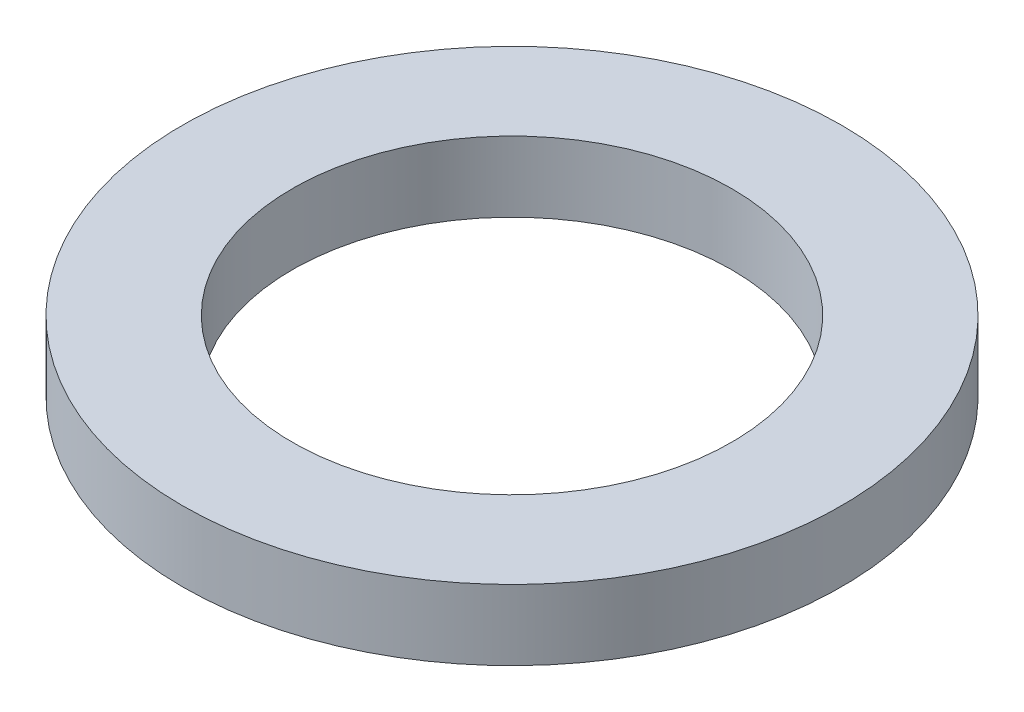
ISO-10303-21;
HEADER;
FILE_DESCRIPTION(('STEP AP214'),'2;1');
FILE_NAME('part.step','',(''),(''),'','','');
FILE_SCHEMA(('AUTOMOTIVE_DESIGN { 1 0 10303 214 1 1 1 1 }'));
ENDSEC;
DATA;
#1=APPLICATION_CONTEXT('core data for automotive mechanical design processes');
#2=APPLICATION_PROTOCOL_DEFINITION('international standard','automotive_design',2000,#1);
#3=PRODUCT_CONTEXT('',#1,'mechanical');
#4=PRODUCT('Part','Part','',(#3));
#5=PRODUCT_RELATED_PRODUCT_CATEGORY('part','',(#4));
#6=PRODUCT_DEFINITION_FORMATION('','',#4);
#7=PRODUCT_DEFINITION_CONTEXT('part definition',#1,'design');
#8=PRODUCT_DEFINITION('design','',#6,#7);
#9=PRODUCT_DEFINITION_SHAPE('','',#8);
#10=(LENGTH_UNIT() NAMED_UNIT(*) SI_UNIT(.MILLI.,.METRE.));
#11=(NAMED_UNIT(*) PLANE_ANGLE_UNIT() SI_UNIT($,.RADIAN.));
#12=(NAMED_UNIT(*) SI_UNIT($,.STERADIAN.) SOLID_ANGLE_UNIT());
#13=UNCERTAINTY_MEASURE_WITH_UNIT(LENGTH_MEASURE(1.E-05),#10,'distance_accuracy_value','');
#14=(GEOMETRIC_REPRESENTATION_CONTEXT(3) GLOBAL_UNCERTAINTY_ASSIGNED_CONTEXT((#13)) GLOBAL_UNIT_ASSIGNED_CONTEXT((#10,
#11,#12)) REPRESENTATION_CONTEXT('',''));
#15=CARTESIAN_POINT('',(0.,0.,0.));
#16=DIRECTION('',(0.,0.,1.));
#17=DIRECTION('',(1.,0.,0.));
#18=AXIS2_PLACEMENT_3D('',#15,#16,#17);
#19=CARTESIAN_POINT('',(0.,0.32,0.));
#20=DIRECTION('',(0.,1.,0.));
#21=DIRECTION('',(0.,0.,1.));
#22=AXIS2_PLACEMENT_3D('',#19,#20,#21);
#23=PLANE('',#22);
#24=CARTESIAN_POINT('',(0.,0.32,0.));
#25=DIRECTION('',(0.,1.,0.));
#26=DIRECTION('',(0.,0.,1.));
#27=AXIS2_PLACEMENT_3D('',#24,#25,#26);
#28=CIRCLE('',#27,1.5);
#29=CARTESIAN_POINT('',(0.,0.32,-1.5));
#30=VERTEX_POINT('',#29);
#31=EDGE_CURVE('E10',#30,#30,#28,.T.);
#32=ORIENTED_EDGE('',*,*,#31,.T.);
#33=EDGE_LOOP('',(#32));
#34=FACE_BOUND('',#33,.T.);
#35=CARTESIAN_POINT('',(0.,0.32,0.));
#36=DIRECTION('',(0.,1.,0.));
#37=DIRECTION('',(0.,0.,1.));
#38=AXIS2_PLACEMENT_3D('',#35,#36,#37);
#39=CIRCLE('',#38,1.);
#40=CARTESIAN_POINT('',(0.,0.32,-1.));
#41=VERTEX_POINT('',#40);
#42=EDGE_CURVE('E41',#41,#41,#39,.T.);
#43=ORIENTED_EDGE('',*,*,#42,.F.);
#44=EDGE_LOOP('',(#43));
#45=FACE_BOUND('',#44,.T.);
#46=ADVANCED_FACE('F30',(#34,#45),#23,.T.);
#47=CARTESIAN_POINT('',(0.,0.,0.));
#48=DIRECTION('',(0.,1.,0.));
#49=DIRECTION('',(0.,0.,1.));
#50=AXIS2_PLACEMENT_3D('',#47,#48,#49);
#51=PLANE('',#50);
#52=CARTESIAN_POINT('',(0.,0.,0.));
#53=DIRECTION('',(0.,1.,0.));
#54=DIRECTION('',(0.,0.,1.));
#55=AXIS2_PLACEMENT_3D('',#52,#53,#54);
#56=CIRCLE('',#55,1.5);
#57=CARTESIAN_POINT('',(0.,0.,-1.5));
#58=VERTEX_POINT('',#57);
#59=EDGE_CURVE('E34',#58,#58,#56,.T.);
#60=ORIENTED_EDGE('',*,*,#59,.F.);
#61=EDGE_LOOP('',(#60));
#62=FACE_BOUND('',#61,.T.);
#63=CARTESIAN_POINT('',(0.,0.,0.));
#64=DIRECTION('',(0.,1.,0.));
#65=DIRECTION('',(0.,0.,1.));
#66=AXIS2_PLACEMENT_3D('',#63,#64,#65);
#67=CIRCLE('',#66,1.);
#68=CARTESIAN_POINT('',(0.,0.,-1.));
#69=VERTEX_POINT('',#68);
#70=EDGE_CURVE('E43',#69,#69,#67,.T.);
#71=ORIENTED_EDGE('',*,*,#70,.T.);
#72=EDGE_LOOP('',(#71));
#73=FACE_BOUND('',#72,.T.);
#74=ADVANCED_FACE('F53',(#62,#73),#51,.F.);
#75=CARTESIAN_POINT('',(0.,0.32,0.));
#76=DIRECTION('',(0.,-1.,0.));
#77=DIRECTION('',(0.,0.,-1.));
#78=AXIS2_PLACEMENT_3D('',#75,#76,#77);
#79=CYLINDRICAL_SURFACE('',#78,1.5);
#80=CARTESIAN_POINT('',(0.,0.32,-1.5));
#81=CARTESIAN_POINT('',(0.,0.316666666666667,-1.5));
#82=CARTESIAN_POINT('',(0.,0.313333333333333,-1.5));
#83=CARTESIAN_POINT('',(0.,0.306666666666667,-1.5));
#84=CARTESIAN_POINT('',(0.,0.303333333333333,-1.5));
#85=CARTESIAN_POINT('',(0.,0.296666666666667,-1.5));
#86=CARTESIAN_POINT('',(0.,0.293333333333333,-1.5));
#87=CARTESIAN_POINT('',(0.,0.286666666666667,-1.5));
#88=CARTESIAN_POINT('',(0.,0.283333333333333,-1.5));
#89=CARTESIAN_POINT('',(0.,0.276666666666667,-1.5));
#90=CARTESIAN_POINT('',(0.,0.273333333333333,-1.5));
#91=CARTESIAN_POINT('',(0.,0.266666666666667,-1.5));
#92=CARTESIAN_POINT('',(0.,0.263333333333333,-1.5));
#93=CARTESIAN_POINT('',(0.,0.256666666666667,-1.5));
#94=CARTESIAN_POINT('',(0.,0.253333333333333,-1.5));
#95=CARTESIAN_POINT('',(0.,0.246666666666667,-1.5));
#96=CARTESIAN_POINT('',(0.,0.243333333333333,-1.5));
#97=CARTESIAN_POINT('',(0.,0.236666666666667,-1.5));
#98=CARTESIAN_POINT('',(0.,0.233333333333333,-1.5));
#99=CARTESIAN_POINT('',(0.,0.226666666666667,-1.5));
#100=CARTESIAN_POINT('',(0.,0.223333333333333,-1.5));
#101=CARTESIAN_POINT('',(0.,0.216666666666667,-1.5));
#102=CARTESIAN_POINT('',(0.,0.213333333333333,-1.5));
#103=CARTESIAN_POINT('',(0.,0.206666666666667,-1.5));
#104=CARTESIAN_POINT('',(0.,0.203333333333333,-1.5));
#105=CARTESIAN_POINT('',(0.,0.196666666666667,-1.5));
#106=CARTESIAN_POINT('',(0.,0.193333333333333,-1.5));
#107=CARTESIAN_POINT('',(0.,0.186666666666667,-1.5));
#108=CARTESIAN_POINT('',(0.,0.183333333333333,-1.5));
#109=CARTESIAN_POINT('',(0.,0.176666666666667,-1.5));
#110=CARTESIAN_POINT('',(0.,0.173333333333333,-1.5));
#111=CARTESIAN_POINT('',(0.,0.166666666666667,-1.5));
#112=CARTESIAN_POINT('',(0.,0.163333333333333,-1.5));
#113=CARTESIAN_POINT('',(0.,0.156666666666667,-1.5));
#114=CARTESIAN_POINT('',(0.,0.153333333333333,-1.5));
#115=CARTESIAN_POINT('',(0.,0.146666666666667,-1.5));
#116=CARTESIAN_POINT('',(0.,0.143333333333333,-1.5));
#117=CARTESIAN_POINT('',(0.,0.136666666666667,-1.5));
#118=CARTESIAN_POINT('',(0.,0.133333333333333,-1.5));
#119=CARTESIAN_POINT('',(0.,0.126666666666667,-1.5));
#120=CARTESIAN_POINT('',(0.,0.123333333333333,-1.5));
#121=CARTESIAN_POINT('',(0.,0.116666666666667,-1.5));
#122=CARTESIAN_POINT('',(0.,0.113333333333333,-1.5));
#123=CARTESIAN_POINT('',(0.,0.106666666666667,-1.5));
#124=CARTESIAN_POINT('',(0.,0.103333333333333,-1.5));
#125=CARTESIAN_POINT('',(0.,0.0966666666666667,-1.5));
#126=CARTESIAN_POINT('',(0.,0.0933333333333334,-1.5));
#127=CARTESIAN_POINT('',(0.,0.0866666666666667,-1.5));
#128=CARTESIAN_POINT('',(0.,0.0833333333333333,-1.5));
#129=CARTESIAN_POINT('',(0.,0.0766666666666667,-1.5));
#130=CARTESIAN_POINT('',(0.,0.0733333333333333,-1.5));
#131=CARTESIAN_POINT('',(0.,0.0666666666666667,-1.5));
#132=CARTESIAN_POINT('',(0.,0.0633333333333333,-1.5));
#133=CARTESIAN_POINT('',(0.,0.0566666666666667,-1.5));
#134=CARTESIAN_POINT('',(0.,0.0533333333333333,-1.5));
#135=CARTESIAN_POINT('',(0.,0.0466666666666667,-1.5));
#136=CARTESIAN_POINT('',(0.,0.0433333333333333,-1.5));
#137=CARTESIAN_POINT('',(0.,0.0366666666666667,-1.5));
#138=CARTESIAN_POINT('',(0.,0.0333333333333333,-1.5));
#139=CARTESIAN_POINT('',(0.,0.0266666666666667,-1.5));
#140=CARTESIAN_POINT('',(0.,0.0233333333333333,-1.5));
#141=CARTESIAN_POINT('',(0.,0.0166666666666667,-1.5));
#142=CARTESIAN_POINT('',(0.,0.0133333333333334,-1.5));
#143=CARTESIAN_POINT('',(0.,0.00666666666666668,-1.5));
#144=CARTESIAN_POINT('',(0.,0.00333333333333334,-1.5));
#145=CARTESIAN_POINT('',(0.,0.,-1.5));
#146=B_SPLINE_CURVE_WITH_KNOTS('',3,(#80,#81,#82,#83,#84,#85,#86,#87,#88,#89,#90,#91,#92,#93,
#94,#95,#96,#97,#98,#99,#100,#101,#102,#103,#104,#105,#106,#107,#108,#109,#110,#111,#112,#113,
#114,#115,#116,#117,#118,#119,#120,#121,#122,#123,#124,#125,#126,#127,#128,#129,#130,#131,#132,
#133,#134,#135,#136,#137,#138,#139,#140,#141,#142,#143,#144,#145),.UNSPECIFIED.,.F.,.F.,(4,2,2,
2,2,2,2,2,2,2,2,2,2,2,2,2,2,2,2,2,2,2,2,2,2,2,2,2,2,2,2,2,4),(0.,0.00999999999999997,
0.0199999999999999,0.03,0.04,0.05,0.06,0.07,0.08,0.09,0.1,0.11,0.12,0.13,0.14,0.15,0.16,0.17,
0.18,0.19,0.2,0.21,0.22,0.23,0.24,0.25,0.26,0.27,0.28,0.29,0.3,0.31,0.32),.UNSPECIFIED.);
#147=EDGE_CURVE('BSEAM32',#30,#58,#146,.T.);
#148=ORIENTED_EDGE('',*,*,#31,.F.);
#149=ORIENTED_EDGE('',*,*,#59,.T.);
#150=ORIENTED_EDGE('',*,*,#147,.T.);
#151=ORIENTED_EDGE('',*,*,#147,.F.);
#152=EDGE_LOOP('',(#148,#150,#149,#151));
#153=FACE_BOUND('',#152,.T.);
#154=ADVANCED_FACE('F32',(#153),#79,.T.);
#155=CARTESIAN_POINT('',(0.,0.32,0.));
#156=DIRECTION('',(0.,-1.,0.));
#157=DIRECTION('',(0.,0.,-1.));
#158=AXIS2_PLACEMENT_3D('',#155,#156,#157);
#159=CYLINDRICAL_SURFACE('',#158,1.);
#160=CARTESIAN_POINT('',(0.,0.32,-1.));
#161=CARTESIAN_POINT('',(0.,0.316666666666667,-1.));
#162=CARTESIAN_POINT('',(0.,0.313333333333333,-1.));
#163=CARTESIAN_POINT('',(0.,0.306666666666667,-1.));
#164=CARTESIAN_POINT('',(0.,0.303333333333333,-1.));
#165=CARTESIAN_POINT('',(0.,0.296666666666667,-1.));
#166=CARTESIAN_POINT('',(0.,0.293333333333333,-1.));
#167=CARTESIAN_POINT('',(0.,0.286666666666667,-1.));
#168=CARTESIAN_POINT('',(0.,0.283333333333333,-1.));
#169=CARTESIAN_POINT('',(0.,0.276666666666667,-1.));
#170=CARTESIAN_POINT('',(0.,0.273333333333333,-1.));
#171=CARTESIAN_POINT('',(0.,0.266666666666667,-1.));
#172=CARTESIAN_POINT('',(0.,0.263333333333333,-1.));
#173=CARTESIAN_POINT('',(0.,0.256666666666667,-1.));
#174=CARTESIAN_POINT('',(0.,0.253333333333333,-1.));
#175=CARTESIAN_POINT('',(0.,0.246666666666667,-1.));
#176=CARTESIAN_POINT('',(0.,0.243333333333333,-1.));
#177=CARTESIAN_POINT('',(0.,0.236666666666667,-1.));
#178=CARTESIAN_POINT('',(0.,0.233333333333333,-1.));
#179=CARTESIAN_POINT('',(0.,0.226666666666667,-1.));
#180=CARTESIAN_POINT('',(0.,0.223333333333333,-1.));
#181=CARTESIAN_POINT('',(0.,0.216666666666667,-1.));
#182=CARTESIAN_POINT('',(0.,0.213333333333333,-1.));
#183=CARTESIAN_POINT('',(0.,0.206666666666667,-1.));
#184=CARTESIAN_POINT('',(0.,0.203333333333333,-1.));
#185=CARTESIAN_POINT('',(0.,0.196666666666667,-1.));
#186=CARTESIAN_POINT('',(0.,0.193333333333333,-1.));
#187=CARTESIAN_POINT('',(0.,0.186666666666667,-1.));
#188=CARTESIAN_POINT('',(0.,0.183333333333333,-1.));
#189=CARTESIAN_POINT('',(0.,0.176666666666667,-1.));
#190=CARTESIAN_POINT('',(0.,0.173333333333333,-1.));
#191=CARTESIAN_POINT('',(0.,0.166666666666667,-1.));
#192=CARTESIAN_POINT('',(0.,0.163333333333333,-1.));
#193=CARTESIAN_POINT('',(0.,0.156666666666667,-1.));
#194=CARTESIAN_POINT('',(0.,0.153333333333333,-1.));
#195=CARTESIAN_POINT('',(0.,0.146666666666667,-1.));
#196=CARTESIAN_POINT('',(0.,0.143333333333333,-1.));
#197=CARTESIAN_POINT('',(0.,0.136666666666667,-1.));
#198=CARTESIAN_POINT('',(0.,0.133333333333333,-1.));
#199=CARTESIAN_POINT('',(0.,0.126666666666667,-1.));
#200=CARTESIAN_POINT('',(0.,0.123333333333333,-1.));
#201=CARTESIAN_POINT('',(0.,0.116666666666667,-1.));
#202=CARTESIAN_POINT('',(0.,0.113333333333333,-1.));
#203=CARTESIAN_POINT('',(0.,0.106666666666667,-1.));
#204=CARTESIAN_POINT('',(0.,0.103333333333333,-1.));
#205=CARTESIAN_POINT('',(0.,0.0966666666666667,-1.));
#206=CARTESIAN_POINT('',(0.,0.0933333333333334,-1.));
#207=CARTESIAN_POINT('',(0.,0.0866666666666667,-1.));
#208=CARTESIAN_POINT('',(0.,0.0833333333333333,-1.));
#209=CARTESIAN_POINT('',(0.,0.0766666666666667,-1.));
#210=CARTESIAN_POINT('',(0.,0.0733333333333333,-1.));
#211=CARTESIAN_POINT('',(0.,0.0666666666666667,-1.));
#212=CARTESIAN_POINT('',(0.,0.0633333333333333,-1.));
#213=CARTESIAN_POINT('',(0.,0.0566666666666667,-1.));
#214=CARTESIAN_POINT('',(0.,0.0533333333333333,-1.));
#215=CARTESIAN_POINT('',(0.,0.0466666666666667,-1.));
#216=CARTESIAN_POINT('',(0.,0.0433333333333333,-1.));
#217=CARTESIAN_POINT('',(0.,0.0366666666666667,-1.));
#218=CARTESIAN_POINT('',(0.,0.0333333333333333,-1.));
#219=CARTESIAN_POINT('',(0.,0.0266666666666667,-1.));
#220=CARTESIAN_POINT('',(0.,0.0233333333333333,-1.));
#221=CARTESIAN_POINT('',(0.,0.0166666666666667,-1.));
#222=CARTESIAN_POINT('',(0.,0.0133333333333334,-1.));
#223=CARTESIAN_POINT('',(0.,0.00666666666666668,-1.));
#224=CARTESIAN_POINT('',(0.,0.00333333333333334,-1.));
#225=CARTESIAN_POINT('',(0.,0.,-1.));
#226=B_SPLINE_CURVE_WITH_KNOTS('',3,(#160,#161,#162,#163,#164,#165,#166,#167,#168,#169,#170,
#171,#172,#173,#174,#175,#176,#177,#178,#179,#180,#181,#182,#183,#184,#185,#186,#187,#188,#189,
#190,#191,#192,#193,#194,#195,#196,#197,#198,#199,#200,#201,#202,#203,#204,#205,#206,#207,#208,
#209,#210,#211,#212,#213,#214,#215,#216,#217,#218,#219,#220,#221,#222,#223,#224,#225),
.UNSPECIFIED.,.F.,.F.,(4,2,2,2,2,2,2,2,2,2,2,2,2,2,2,2,2,2,2,2,2,2,2,2,2,2,2,2,2,2,2,2,4),(0.,
0.00999999999999997,0.0199999999999999,0.03,0.04,0.05,0.06,0.07,0.08,0.09,0.1,0.11,0.12,0.13,
0.14,0.15,0.16,0.17,0.18,0.19,0.2,0.21,0.22,0.23,0.24,0.25,0.26,0.27,0.28,0.29,0.3,0.31,0.32),.UNSPECIFIED.);
#227=EDGE_CURVE('BSEAM49',#41,#69,#226,.T.);
#228=ORIENTED_EDGE('',*,*,#42,.T.);
#229=ORIENTED_EDGE('',*,*,#70,.F.);
#230=ORIENTED_EDGE('',*,*,#227,.T.);
#231=ORIENTED_EDGE('',*,*,#227,.F.);
#232=EDGE_LOOP('',(#228,#230,#229,#231));
#233=FACE_BOUND('',#232,.T.);
#234=ADVANCED_FACE('F49',(#233),#159,.F.);
#235=CLOSED_SHELL('',(#46,#74,#154,#234));
#236=MANIFOLD_SOLID_BREP('B2',#235);
#237=ADVANCED_BREP_SHAPE_REPRESENTATION('',(#18,#236),#14);
#238=SHAPE_DEFINITION_REPRESENTATION(#9,#237);
ENDSEC;
END-ISO-10303-21;
